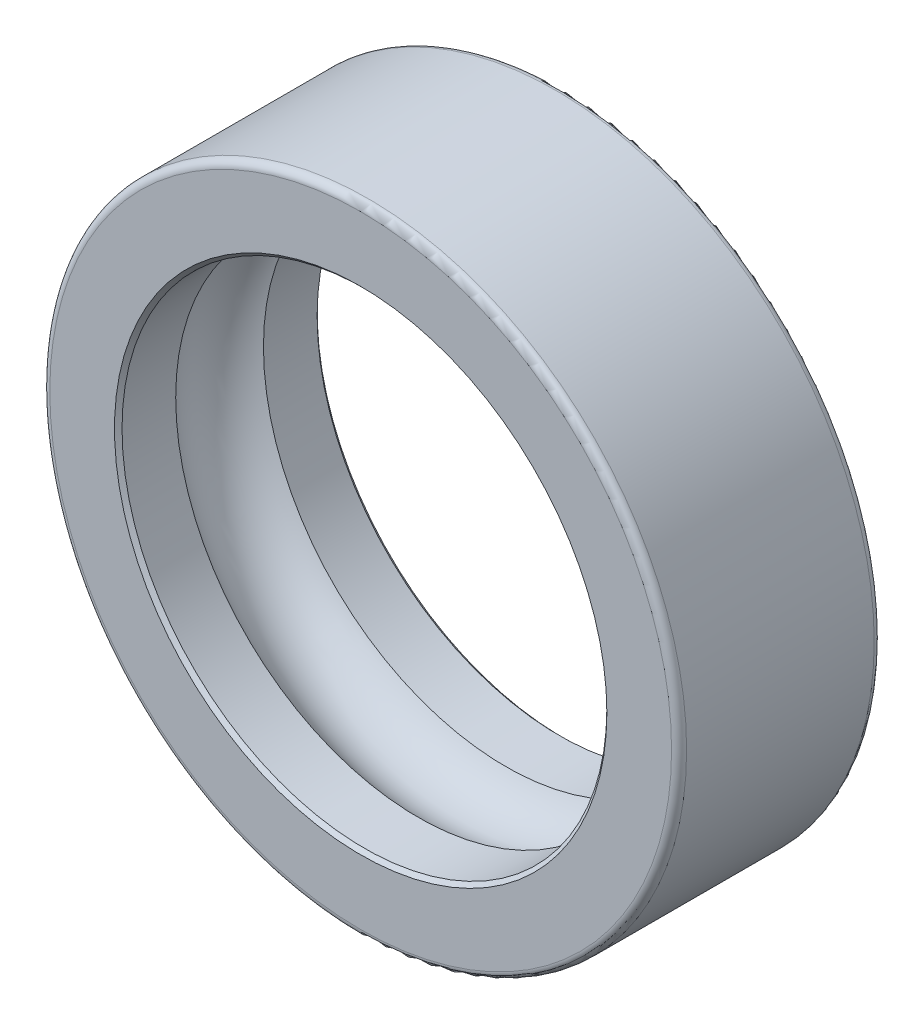
ISO-10303-21;
HEADER;
FILE_DESCRIPTION(('STEP AP214'),'2;1');
FILE_NAME('part.step','',(''),(''),'','','');
FILE_SCHEMA(('AUTOMOTIVE_DESIGN { 1 0 10303 214 1 1 1 1 }'));
ENDSEC;
DATA;
#1=APPLICATION_CONTEXT('core data for automotive mechanical design processes');
#2=APPLICATION_PROTOCOL_DEFINITION('international standard','automotive_design',2000,#1);
#3=PRODUCT_CONTEXT('',#1,'mechanical');
#4=PRODUCT('Part','Part','',(#3));
#5=PRODUCT_RELATED_PRODUCT_CATEGORY('part','',(#4));
#6=PRODUCT_DEFINITION_FORMATION('','',#4);
#7=PRODUCT_DEFINITION_CONTEXT('part definition',#1,'design');
#8=PRODUCT_DEFINITION('design','',#6,#7);
#9=PRODUCT_DEFINITION_SHAPE('','',#8);
#10=(LENGTH_UNIT() NAMED_UNIT(*) SI_UNIT(.MILLI.,.METRE.));
#11=(NAMED_UNIT(*) PLANE_ANGLE_UNIT() SI_UNIT($,.RADIAN.));
#12=(NAMED_UNIT(*) SI_UNIT($,.STERADIAN.) SOLID_ANGLE_UNIT());
#13=UNCERTAINTY_MEASURE_WITH_UNIT(LENGTH_MEASURE(1.E-05),#10,'distance_accuracy_value','');
#14=(GEOMETRIC_REPRESENTATION_CONTEXT(3) GLOBAL_UNCERTAINTY_ASSIGNED_CONTEXT((#13)) GLOBAL_UNIT_ASSIGNED_CONTEXT((#10,
#11,#12)) REPRESENTATION_CONTEXT('',''));
#15=CARTESIAN_POINT('',(0.,0.,0.));
#16=DIRECTION('',(0.,0.,1.));
#17=DIRECTION('',(1.,0.,0.));
#18=AXIS2_PLACEMENT_3D('',#15,#16,#17);
#19=CARTESIAN_POINT('',(0.,0.,3.24));
#20=DIRECTION('',(0.,0.,1.));
#21=DIRECTION('',(1.,0.,0.));
#22=AXIS2_PLACEMENT_3D('',#19,#20,#21);
#23=TOROIDAL_SURFACE('',#22,10.74,0.26);
#24=CARTESIAN_POINT('',(0.,0.,3.5));
#25=DIRECTION('',(0.,0.,1.));
#26=DIRECTION('',(1.,0.,0.));
#27=AXIS2_PLACEMENT_3D('',#24,#25,#26);
#28=CIRCLE('',#27,10.74);
#29=CARTESIAN_POINT('',(10.74,0.,3.5));
#30=VERTEX_POINT('',#29);
#31=EDGE_CURVE('E10',#30,#30,#28,.T.);
#32=ORIENTED_EDGE('',*,*,#31,.F.);
#33=EDGE_LOOP('',(#32));
#34=FACE_BOUND('',#33,.T.);
#35=CARTESIAN_POINT('',(0.,0.,3.24));
#36=DIRECTION('',(0.,0.,1.));
#37=DIRECTION('',(1.,0.,0.));
#38=AXIS2_PLACEMENT_3D('',#35,#36,#37);
#39=CIRCLE('',#38,11.);
#40=CARTESIAN_POINT('',(11.,0.,3.24));
#41=VERTEX_POINT('',#40);
#42=EDGE_CURVE('E64',#41,#41,#39,.T.);
#43=ORIENTED_EDGE('',*,*,#42,.T.);
#44=EDGE_LOOP('',(#43));
#45=FACE_BOUND('',#44,.T.);
#46=ADVANCED_FACE('F30',(#34,#45),#23,.T.);
#47=CARTESIAN_POINT('',(0.,8.505,3.5));
#48=DIRECTION('',(0.,0.,-1.));
#49=DIRECTION('',(-1.,0.,0.));
#50=AXIS2_PLACEMENT_3D('',#47,#48,#49);
#51=PLANE('',#50);
#52=CARTESIAN_POINT('',(0.,0.,3.5));
#53=DIRECTION('',(0.,0.,1.));
#54=DIRECTION('',(1.,0.,0.));
#55=AXIS2_PLACEMENT_3D('',#52,#53,#54);
#56=CIRCLE('',#55,8.505);
#57=CARTESIAN_POINT('',(8.505,0.,3.5));
#58=VERTEX_POINT('',#57);
#59=EDGE_CURVE('E36',#58,#58,#56,.T.);
#60=ORIENTED_EDGE('',*,*,#59,.F.);
#61=EDGE_LOOP('',(#60));
#62=FACE_BOUND('',#61,.T.);
#63=ORIENTED_EDGE('',*,*,#31,.T.);
#64=EDGE_LOOP('',(#63));
#65=FACE_BOUND('',#64,.T.);
#66=ADVANCED_FACE('F113',(#62,#65),#51,.F.);
#67=CARTESIAN_POINT('',(0.,0.,3.5));
#68=DIRECTION('',(0.,0.,1.));
#69=DIRECTION('',(1.,0.,0.));
#70=AXIS2_PLACEMENT_3D('',#67,#68,#69);
#71=CONICAL_SURFACE('',#70,8.505,0.785398163397448);
#72=CARTESIAN_POINT('',(0.,0.,3.37));
#73=DIRECTION('',(0.,0.,1.));
#74=DIRECTION('',(1.,0.,0.));
#75=AXIS2_PLACEMENT_3D('',#72,#73,#74);
#76=CIRCLE('',#75,8.375);
#77=CARTESIAN_POINT('',(8.375,0.,3.37));
#78=VERTEX_POINT('',#77);
#79=EDGE_CURVE('E40',#78,#78,#76,.T.);
#80=ORIENTED_EDGE('',*,*,#79,.F.);
#81=EDGE_LOOP('',(#80));
#82=FACE_BOUND('',#81,.T.);
#83=ORIENTED_EDGE('',*,*,#59,.T.);
#84=EDGE_LOOP('',(#83));
#85=FACE_BOUND('',#84,.T.);
#86=ADVANCED_FACE('F108',(#82,#85),#71,.F.);
#87=CARTESIAN_POINT('',(0.,0.,3.5));
#88=DIRECTION('',(0.,0.,1.));
#89=DIRECTION('',(1.,0.,0.));
#90=AXIS2_PLACEMENT_3D('',#87,#88,#89);
#91=CYLINDRICAL_SURFACE('',#90,8.375);
#92=CARTESIAN_POINT('',(0.,0.,1.51554445662277));
#93=DIRECTION('',(0.,0.,1.));
#94=DIRECTION('',(1.,0.,0.));
#95=AXIS2_PLACEMENT_3D('',#92,#93,#94);
#96=CIRCLE('',#95,8.375);
#97=CARTESIAN_POINT('',(8.375,0.,1.51554445662277));
#98=VERTEX_POINT('',#97);
#99=EDGE_CURVE('E44',#98,#98,#96,.T.);
#100=ORIENTED_EDGE('',*,*,#99,.F.);
#101=EDGE_LOOP('',(#100));
#102=FACE_BOUND('',#101,.T.);
#103=ORIENTED_EDGE('',*,*,#79,.T.);
#104=EDGE_LOOP('',(#103));
#105=FACE_BOUND('',#104,.T.);
#106=ADVANCED_FACE('F102',(#102,#105),#91,.F.);
#107=CARTESIAN_POINT('',(0.,0.,0.));
#108=DIRECTION('',(0.,0.,1.));
#109=DIRECTION('',(1.,0.,0.));
#110=AXIS2_PLACEMENT_3D('',#107,#108,#109);
#111=TOROIDAL_SURFACE('',#110,7.5,1.75);
#112=CARTESIAN_POINT('',(0.,0.,-1.51554445662277));
#113=DIRECTION('',(0.,0.,1.));
#114=DIRECTION('',(1.,0.,0.));
#115=AXIS2_PLACEMENT_3D('',#112,#113,#114);
#116=CIRCLE('',#115,8.375);
#117=CARTESIAN_POINT('',(8.375,0.,-1.51554445662277));
#118=VERTEX_POINT('',#117);
#119=EDGE_CURVE('E49',#118,#118,#116,.T.);
#120=ORIENTED_EDGE('',*,*,#119,.F.);
#121=EDGE_LOOP('',(#120));
#122=FACE_BOUND('',#121,.T.);
#123=ORIENTED_EDGE('',*,*,#99,.T.);
#124=EDGE_LOOP('',(#123));
#125=FACE_BOUND('',#124,.T.);
#126=ADVANCED_FACE('F96',(#122,#125),#111,.F.);
#127=CARTESIAN_POINT('',(0.,0.,3.5));
#128=DIRECTION('',(0.,0.,1.));
#129=DIRECTION('',(1.,0.,0.));
#130=AXIS2_PLACEMENT_3D('',#127,#128,#129);
#131=CYLINDRICAL_SURFACE('',#130,8.375);
#132=CARTESIAN_POINT('',(0.,0.,-3.37));
#133=DIRECTION('',(0.,0.,1.));
#134=DIRECTION('',(1.,0.,0.));
#135=AXIS2_PLACEMENT_3D('',#132,#133,#134);
#136=CIRCLE('',#135,8.375);
#137=CARTESIAN_POINT('',(8.375,0.,-3.37));
#138=VERTEX_POINT('',#137);
#139=EDGE_CURVE('E52',#138,#138,#136,.T.);
#140=ORIENTED_EDGE('',*,*,#139,.F.);
#141=EDGE_LOOP('',(#140));
#142=FACE_BOUND('',#141,.T.);
#143=ORIENTED_EDGE('',*,*,#119,.T.);
#144=EDGE_LOOP('',(#143));
#145=FACE_BOUND('',#144,.T.);
#146=ADVANCED_FACE('F90',(#142,#145),#131,.F.);
#147=CARTESIAN_POINT('',(0.,0.,-3.37));
#148=DIRECTION('',(0.,0.,-1.));
#149=DIRECTION('',(-1.,0.,0.));
#150=AXIS2_PLACEMENT_3D('',#147,#148,#149);
#151=CONICAL_SURFACE('',#150,8.375,0.785398163397448);
#152=CARTESIAN_POINT('',(0.,0.,-3.5));
#153=DIRECTION('',(0.,0.,1.));
#154=DIRECTION('',(1.,0.,0.));
#155=AXIS2_PLACEMENT_3D('',#152,#153,#154);
#156=CIRCLE('',#155,8.505);
#157=CARTESIAN_POINT('',(8.505,0.,-3.5));
#158=VERTEX_POINT('',#157);
#159=EDGE_CURVE('E55',#158,#158,#156,.T.);
#160=ORIENTED_EDGE('',*,*,#159,.F.);
#161=EDGE_LOOP('',(#160));
#162=FACE_BOUND('',#161,.T.);
#163=ORIENTED_EDGE('',*,*,#139,.T.);
#164=EDGE_LOOP('',(#163));
#165=FACE_BOUND('',#164,.T.);
#166=ADVANCED_FACE('F84',(#162,#165),#151,.F.);
#167=CARTESIAN_POINT('',(0.,8.505,-3.5));
#168=DIRECTION('',(0.,0.,1.));
#169=DIRECTION('',(1.,0.,0.));
#170=AXIS2_PLACEMENT_3D('',#167,#168,#169);
#171=PLANE('',#170);
#172=CARTESIAN_POINT('',(0.,0.,-3.5));
#173=DIRECTION('',(0.,0.,1.));
#174=DIRECTION('',(1.,0.,0.));
#175=AXIS2_PLACEMENT_3D('',#172,#173,#174);
#176=CIRCLE('',#175,10.74);
#177=CARTESIAN_POINT('',(10.74,0.,-3.5));
#178=VERTEX_POINT('',#177);
#179=EDGE_CURVE('E58',#178,#178,#176,.T.);
#180=ORIENTED_EDGE('',*,*,#179,.F.);
#181=EDGE_LOOP('',(#180));
#182=FACE_BOUND('',#181,.T.);
#183=ORIENTED_EDGE('',*,*,#159,.T.);
#184=EDGE_LOOP('',(#183));
#185=FACE_BOUND('',#184,.T.);
#186=ADVANCED_FACE('F78',(#182,#185),#171,.F.);
#187=CARTESIAN_POINT('',(0.,0.,-3.24));
#188=DIRECTION('',(0.,0.,1.));
#189=DIRECTION('',(1.,0.,0.));
#190=AXIS2_PLACEMENT_3D('',#187,#188,#189);
#191=TOROIDAL_SURFACE('',#190,10.74,0.26);
#192=CARTESIAN_POINT('',(0.,0.,-3.24));
#193=DIRECTION('',(0.,0.,1.));
#194=DIRECTION('',(1.,0.,0.));
#195=AXIS2_PLACEMENT_3D('',#192,#193,#194);
#196=CIRCLE('',#195,11.);
#197=CARTESIAN_POINT('',(11.,0.,-3.24));
#198=VERTEX_POINT('',#197);
#199=EDGE_CURVE('E61',#198,#198,#196,.T.);
#200=ORIENTED_EDGE('',*,*,#199,.F.);
#201=EDGE_LOOP('',(#200));
#202=FACE_BOUND('',#201,.T.);
#203=ORIENTED_EDGE('',*,*,#179,.T.);
#204=EDGE_LOOP('',(#203));
#205=FACE_BOUND('',#204,.T.);
#206=ADVANCED_FACE('F72',(#202,#205),#191,.T.);
#207=CARTESIAN_POINT('',(0.,0.,3.5));
#208=DIRECTION('',(0.,0.,1.));
#209=DIRECTION('',(1.,0.,0.));
#210=AXIS2_PLACEMENT_3D('',#207,#208,#209);
#211=CYLINDRICAL_SURFACE('',#210,11.);
#212=ORIENTED_EDGE('',*,*,#42,.F.);
#213=EDGE_LOOP('',(#212));
#214=FACE_BOUND('',#213,.T.);
#215=ORIENTED_EDGE('',*,*,#199,.T.);
#216=EDGE_LOOP('',(#215));
#217=FACE_BOUND('',#216,.T.);
#218=ADVANCED_FACE('F69',(#214,#217),#211,.T.);
#219=CLOSED_SHELL('',(#46,#66,#86,#106,#126,#146,#166,#186,#206,#218));
#220=MANIFOLD_SOLID_BREP('B2',#219);
#221=ADVANCED_BREP_SHAPE_REPRESENTATION('',(#18,#220),#14);
#222=SHAPE_DEFINITION_REPRESENTATION(#9,#221);
ENDSEC;
END-ISO-10303-21;
